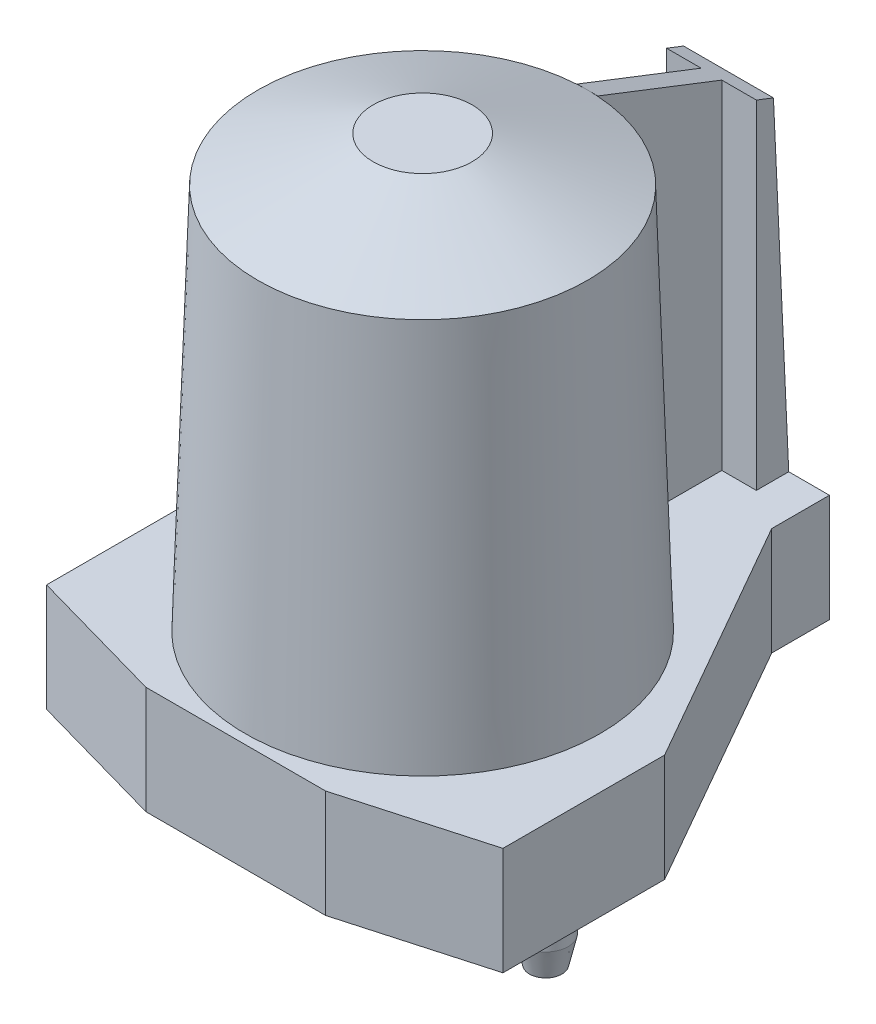
ISO-10303-21;
HEADER;
FILE_DESCRIPTION(('STEP AP214'),'2;1');
FILE_NAME('part.step','',(''),(''),'','','');
FILE_SCHEMA(('AUTOMOTIVE_DESIGN { 1 0 10303 214 1 1 1 1 }'));
ENDSEC;
DATA;
#1=APPLICATION_CONTEXT('core data for automotive mechanical design processes');
#2=APPLICATION_PROTOCOL_DEFINITION('international standard','automotive_design',2000,#1);
#3=PRODUCT_CONTEXT('',#1,'mechanical');
#4=PRODUCT('Part','Part','',(#3));
#5=PRODUCT_RELATED_PRODUCT_CATEGORY('part','',(#4));
#6=PRODUCT_DEFINITION_FORMATION('','',#4);
#7=PRODUCT_DEFINITION_CONTEXT('part definition',#1,'design');
#8=PRODUCT_DEFINITION('design','',#6,#7);
#9=PRODUCT_DEFINITION_SHAPE('','',#8);
#10=(LENGTH_UNIT() NAMED_UNIT(*) SI_UNIT(.MILLI.,.METRE.));
#11=(NAMED_UNIT(*) PLANE_ANGLE_UNIT() SI_UNIT($,.RADIAN.));
#12=(NAMED_UNIT(*) SI_UNIT($,.STERADIAN.) SOLID_ANGLE_UNIT());
#13=UNCERTAINTY_MEASURE_WITH_UNIT(LENGTH_MEASURE(1.E-05),#10,'distance_accuracy_value','');
#14=(GEOMETRIC_REPRESENTATION_CONTEXT(3) GLOBAL_UNCERTAINTY_ASSIGNED_CONTEXT((#13)) GLOBAL_UNIT_ASSIGNED_CONTEXT((#10,
#11,#12)) REPRESENTATION_CONTEXT('',''));
#15=CARTESIAN_POINT('',(0.,0.,0.));
#16=DIRECTION('',(0.,0.,1.));
#17=DIRECTION('',(1.,0.,0.));
#18=AXIS2_PLACEMENT_3D('',#15,#16,#17);
#19=CARTESIAN_POINT('',(0.,6.,0.));
#20=DIRECTION('',(0.,-1.,0.));
#21=DIRECTION('',(0.,0.,-1.));
#22=AXIS2_PLACEMENT_3D('',#19,#20,#21);
#23=PLANE('',#22);
#24=DIRECTION('',(-1.,0.,0.));
#25=VECTOR('',#24,1.);
#26=CARTESIAN_POINT('',(2.5,6.,-16.0744409311704));
#27=LINE('',#26,#25);
#28=CARTESIAN_POINT('',(2.5,6.,-16.0744409311704));
#29=VERTEX_POINT('',#28);
#30=CARTESIAN_POINT('',(0.575,5.99999999999999,-16.0744409311704));
#31=VERTEX_POINT('',#30);
#32=EDGE_CURVE('E206',#29,#31,#27,.T.);
#33=ORIENTED_EDGE('',*,*,#32,.T.);
#34=DIRECTION('',(0.,0.,-1.));
#35=VECTOR('',#34,1.);
#36=CARTESIAN_POINT('',(0.575,6.,-9.875));
#37=LINE('',#36,#35);
#38=CARTESIAN_POINT('',(0.575,6.,-9.85824527996742));
#39=VERTEX_POINT('',#38);
#40=EDGE_CURVE('E226',#39,#31,#37,.T.);
#41=ORIENTED_EDGE('',*,*,#40,.F.);
#42=CARTESIAN_POINT('',(0.,6.,0.));
#43=DIRECTION('',(0.,1.,0.));
#44=DIRECTION('',(0.,0.,1.));
#45=AXIS2_PLACEMENT_3D('',#42,#43,#44);
#46=CIRCLE('',#45,9.875);
#47=CARTESIAN_POINT('',(-0.575,6.,-9.85824527996742));
#48=VERTEX_POINT('',#47);
#49=EDGE_CURVE('E331',#48,#39,#46,.T.);
#50=ORIENTED_EDGE('',*,*,#49,.F.);
#51=DIRECTION('',(0.,0.,-1.));
#52=VECTOR('',#51,1.);
#53=CARTESIAN_POINT('',(-0.575,6.,-17.875));
#54=LINE('',#53,#52);
#55=CARTESIAN_POINT('',(-0.575,6.,-16.0744409311704));
#56=VERTEX_POINT('',#55);
#57=EDGE_CURVE('E235',#48,#56,#54,.T.);
#58=ORIENTED_EDGE('',*,*,#57,.T.);
#59=CARTESIAN_POINT('',(-2.5,6.,-16.0744409311704));
#60=VERTEX_POINT('',#59);
#61=EDGE_CURVE('E54',#56,#60,#27,.T.);
#62=ORIENTED_EDGE('',*,*,#61,.T.);
#63=DIRECTION('',(0.,0.,-1.));
#64=VECTOR('',#63,1.);
#65=CARTESIAN_POINT('',(-2.5,6.,-17.875));
#66=LINE('',#65,#64);
#67=CARTESIAN_POINT('',(-2.5,6.,-17.875));
#68=VERTEX_POINT('',#67);
#69=EDGE_CURVE('E199',#60,#68,#66,.T.);
#70=ORIENTED_EDGE('',*,*,#69,.T.);
#71=DIRECTION('',(-1.,0.,0.));
#72=VECTOR('',#71,1.);
#73=CARTESIAN_POINT('',(10.7712987771172,6.,-17.875));
#74=LINE('',#73,#72);
#75=CARTESIAN_POINT('',(-4.765,6.,-17.875));
#76=VERTEX_POINT('',#75);
#77=EDGE_CURVE('E213',#68,#76,#74,.T.);
#78=ORIENTED_EDGE('',*,*,#77,.T.);
#79=DIRECTION('',(0.,0.,1.));
#80=VECTOR('',#79,1.);
#81=CARTESIAN_POINT('',(-4.765,6.,-14.6639849416337));
#82=LINE('',#81,#80);
#83=CARTESIAN_POINT('',(-4.765,6.,-14.6639849416337));
#84=VERTEX_POINT('',#83);
#85=EDGE_CURVE('E459',#76,#84,#82,.T.);
#86=ORIENTED_EDGE('',*,*,#85,.T.);
#87=DIRECTION('',(-0.4959375,0.,0.868358218763288));
#88=VECTOR('',#87,1.);
#89=CARTESIAN_POINT('',(-12.7,6.,-0.770253441421074));
#90=LINE('',#89,#88);
#91=CARTESIAN_POINT('',(-12.7,6.,-0.770253441421074));
#92=VERTEX_POINT('',#91);
#93=EDGE_CURVE('E460',#84,#92,#90,.T.);
#94=ORIENTED_EDGE('',*,*,#93,.T.);
#95=DIRECTION('',(0.,0.,1.));
#96=VECTOR('',#95,1.);
#97=CARTESIAN_POINT('',(-12.7,6.,8.22974655857893));
#98=LINE('',#97,#96);
#99=CARTESIAN_POINT('',(-12.7,6.,8.22974655857893));
#100=VERTEX_POINT('',#99);
#101=EDGE_CURVE('E409',#92,#100,#98,.T.);
#102=ORIENTED_EDGE('',*,*,#101,.T.);
#103=DIRECTION('',(0.9625,0.,0.271281680177634));
#104=VECTOR('',#103,1.);
#105=CARTESIAN_POINT('',(-5.,6.,10.4));
#106=LINE('',#105,#104);
#107=CARTESIAN_POINT('',(-5.,6.,10.4));
#108=VERTEX_POINT('',#107);
#109=EDGE_CURVE('E424',#100,#108,#106,.T.);
#110=ORIENTED_EDGE('',*,*,#109,.T.);
#111=DIRECTION('',(1.,0.,0.));
#112=VECTOR('',#111,1.);
#113=CARTESIAN_POINT('',(5.,6.,10.4));
#114=LINE('',#113,#112);
#115=CARTESIAN_POINT('',(5.,6.,10.4));
#116=VERTEX_POINT('',#115);
#117=EDGE_CURVE('E449',#108,#116,#114,.T.);
#118=ORIENTED_EDGE('',*,*,#117,.T.);
#119=DIRECTION('',(0.9625,0.,-0.271281680177633));
#120=VECTOR('',#119,1.);
#121=CARTESIAN_POINT('',(5.,6.,10.4));
#122=LINE('',#121,#120);
#123=CARTESIAN_POINT('',(12.7,6.,8.22974655857892));
#124=VERTEX_POINT('',#123);
#125=EDGE_CURVE('E451',#116,#124,#122,.T.);
#126=ORIENTED_EDGE('',*,*,#125,.T.);
#127=DIRECTION('',(0.,0.,-1.));
#128=VECTOR('',#127,1.);
#129=CARTESIAN_POINT('',(12.7,6.,8.22974655857892));
#130=LINE('',#129,#128);
#131=CARTESIAN_POINT('',(12.7,6.,-0.770253441421077));
#132=VERTEX_POINT('',#131);
#133=EDGE_CURVE('E453',#124,#132,#130,.T.);
#134=ORIENTED_EDGE('',*,*,#133,.T.);
#135=DIRECTION('',(-0.4959375,0.,-0.868358218763288));
#136=VECTOR('',#135,1.);
#137=CARTESIAN_POINT('',(12.7,6.,-0.770253441421077));
#138=LINE('',#137,#136);
#139=CARTESIAN_POINT('',(4.765,6.,-14.6639849416337));
#140=VERTEX_POINT('',#139);
#141=EDGE_CURVE('E455',#132,#140,#138,.T.);
#142=ORIENTED_EDGE('',*,*,#141,.T.);
#143=DIRECTION('',(0.,0.,-1.));
#144=VECTOR('',#143,1.);
#145=CARTESIAN_POINT('',(4.765,6.,-14.6639849416337));
#146=LINE('',#145,#144);
#147=CARTESIAN_POINT('',(4.765,6.,-17.875));
#148=VERTEX_POINT('',#147);
#149=EDGE_CURVE('E457',#140,#148,#146,.T.);
#150=ORIENTED_EDGE('',*,*,#149,.T.);
#151=CARTESIAN_POINT('',(2.5,6.,-17.875));
#152=VERTEX_POINT('',#151);
#153=EDGE_CURVE('E219',#148,#152,#74,.T.);
#154=ORIENTED_EDGE('',*,*,#153,.T.);
#155=DIRECTION('',(0.,0.,-1.));
#156=VECTOR('',#155,1.);
#157=CARTESIAN_POINT('',(2.5,6.,-17.875));
#158=LINE('',#157,#156);
#159=EDGE_CURVE('E47',#29,#152,#158,.T.);
#160=ORIENTED_EDGE('',*,*,#159,.F.);
#161=EDGE_LOOP('',(#33,#41,#50,#58,#62,#70,#78,#86,#94,#102,#110,#118,#126,#134,#142,#150,#154,#160));
#162=FACE_BOUND('',#161,.T.);
#163=ADVANCED_FACE('F32',(#162),#23,.F.);
#164=CARTESIAN_POINT('',(0.575,0.,0.));
#165=DIRECTION('',(1.,0.,0.));
#166=DIRECTION('',(0.,0.,-1.));
#167=AXIS2_PLACEMENT_3D('',#164,#165,#166);
#168=PLANE('',#167);
#169=ORIENTED_EDGE('',*,*,#40,.T.);
#170=DIRECTION('',(0.,1.,0.));
#171=VECTOR('',#170,1.);
#172=CARTESIAN_POINT('',(0.575,0.,-16.0744409311704));
#173=LINE('',#172,#171);
#174=CARTESIAN_POINT('',(0.575,24.8153926337858,-16.0744409311704));
#175=VERTEX_POINT('',#174);
#176=EDGE_CURVE('E208',#31,#175,#173,.T.);
#177=ORIENTED_EDGE('',*,*,#176,.T.);
#178=DIRECTION('',(0.,0.362621246252393,0.931936602868651));
#179=VECTOR('',#178,1.);
#180=CARTESIAN_POINT('',(0.575,27.5,-9.175));
#181=LINE('',#180,#179);
#182=CARTESIAN_POINT('',(0.575,27.5,-9.175));
#183=VERTEX_POINT('',#182);
#184=EDGE_CURVE('E230',#175,#183,#181,.T.);
#185=ORIENTED_EDGE('',*,*,#184,.T.);
#186=DIRECTION('',(0.,0.,1.));
#187=VECTOR('',#186,1.);
#188=CARTESIAN_POINT('',(0.575,27.5,-8.375));
#189=LINE('',#188,#187);
#190=CARTESIAN_POINT('',(0.575,27.5,-9.15696456256111));
#191=VERTEX_POINT('',#190);
#192=EDGE_CURVE('E223',#183,#191,#189,.T.);
#193=ORIENTED_EDGE('',*,*,#192,.T.);
#194=CARTESIAN_POINT('',(0.575,-10.2381493438928,-10.3877819749739));
#195=CARTESIAN_POINT('',(0.575,-3.92258606455253,-10.1818433551127));
#196=CARTESIAN_POINT('',(0.575,2.39297665254325,-9.97588748900272));
#197=CARTESIAN_POINT('',(0.575,15.0241006157113,-9.56393065339247));
#198=CARTESIAN_POINT('',(0.575,21.3396618617835,-9.35792968389225));
#199=CARTESIAN_POINT('',(0.575,40.6352403416185,-8.72846132617669));
#200=CARTESIAN_POINT('',(0.575,53.6152546454189,-8.30490412574988));
#201=CARTESIAN_POINT('',(0.575,66.5952636062189,-7.88118319722219));
#202=B_SPLINE_CURVE_WITH_KNOTS('',3,(#194,#195,#196,#197,#198,#199,#200,#201),.UNSPECIFIED.,.F.,
.F.,(4,2,2,4),(0.,18.9567600676243,37.9135201352793,76.8742894829481),.UNSPECIFIED.);
#203=EDGE_CURVE('E248',#191,#39,#202,.F.);
#204=ORIENTED_EDGE('',*,*,#203,.T.);
#205=EDGE_LOOP('',(#169,#177,#185,#193,#204));
#206=FACE_BOUND('',#205,.T.);
#207=ADVANCED_FACE('F269',(#206),#168,.T.);
#208=CARTESIAN_POINT('',(-0.575,0.,0.));
#209=DIRECTION('',(1.,0.,0.));
#210=DIRECTION('',(0.,0.,-1.));
#211=AXIS2_PLACEMENT_3D('',#208,#209,#210);
#212=PLANE('',#211);
#213=DIRECTION('',(0.,1.,0.));
#214=VECTOR('',#213,1.);
#215=CARTESIAN_POINT('',(-0.575,0.,-16.0744409311704));
#216=LINE('',#215,#214);
#217=CARTESIAN_POINT('',(-0.575,24.8153926337858,-16.0744409311704));
#218=VERTEX_POINT('',#217);
#219=EDGE_CURVE('E327',#56,#218,#216,.T.);
#220=ORIENTED_EDGE('',*,*,#219,.F.);
#221=ORIENTED_EDGE('',*,*,#57,.F.);
#222=CARTESIAN_POINT('',(-0.575,-10.2381493438928,-10.3877819749739));
#223=CARTESIAN_POINT('',(-0.575,-3.92258606455253,-10.1818433551127));
#224=CARTESIAN_POINT('',(-0.575,2.39297665254325,-9.97588748900272));
#225=CARTESIAN_POINT('',(-0.575,15.0241006157113,-9.56393065339247));
#226=CARTESIAN_POINT('',(-0.575,21.3396618617835,-9.35792968389225));
#227=CARTESIAN_POINT('',(-0.575,40.6352403416185,-8.72846132617669));
#228=CARTESIAN_POINT('',(-0.575,53.6152546454189,-8.30490412574988));
#229=CARTESIAN_POINT('',(-0.575,66.5952636062189,-7.88118319722219));
#230=B_SPLINE_CURVE_WITH_KNOTS('',3,(#222,#223,#224,#225,#226,#227,#228,#229),.UNSPECIFIED.,.F.,
.F.,(4,2,2,4),(0.,18.9567600676243,37.9135201352793,76.8742894829481),.UNSPECIFIED.);
#231=CARTESIAN_POINT('',(-0.575,27.5,-9.15696456256111));
#232=VERTEX_POINT('',#231);
#233=EDGE_CURVE('E240',#232,#48,#230,.F.);
#234=ORIENTED_EDGE('',*,*,#233,.F.);
#235=DIRECTION('',(0.,0.,1.));
#236=VECTOR('',#235,1.);
#237=CARTESIAN_POINT('',(-0.575,27.5,-8.375));
#238=LINE('',#237,#236);
#239=CARTESIAN_POINT('',(-0.575,27.5,-9.175));
#240=VERTEX_POINT('',#239);
#241=EDGE_CURVE('E217',#240,#232,#238,.T.);
#242=ORIENTED_EDGE('',*,*,#241,.F.);
#243=DIRECTION('',(0.,0.362621246252393,0.931936602868651));
#244=VECTOR('',#243,1.);
#245=CARTESIAN_POINT('',(-0.575,27.5,-9.175));
#246=LINE('',#245,#244);
#247=EDGE_CURVE('E227',#218,#240,#246,.T.);
#248=ORIENTED_EDGE('',*,*,#247,.F.);
#249=EDGE_LOOP('',(#220,#221,#234,#242,#248));
#250=FACE_BOUND('',#249,.T.);
#251=ADVANCED_FACE('F254',(#250),#212,.F.);
#252=CARTESIAN_POINT('',(-5.,6.,10.4));
#253=DIRECTION('',(0.271281680177634,0.,-0.9625));
#254=DIRECTION('',(-0.9625,0.,-0.271281680177634));
#255=AXIS2_PLACEMENT_3D('',#252,#253,#254);
#256=PLANE('',#255);
#257=DIRECTION('',(0.9625,0.,0.271281680177634));
#258=VECTOR('',#257,1.);
#259=CARTESIAN_POINT('',(-5.,0.,10.4));
#260=LINE('',#259,#258);
#261=CARTESIAN_POINT('',(-12.7,0.,8.22974655857893));
#262=VERTEX_POINT('',#261);
#263=CARTESIAN_POINT('',(-5.,0.,10.4));
#264=VERTEX_POINT('',#263);
#265=EDGE_CURVE('E392',#262,#264,#260,.T.);
#266=ORIENTED_EDGE('',*,*,#265,.T.);
#267=DIRECTION('',(0.,-1.,0.));
#268=VECTOR('',#267,1.);
#269=CARTESIAN_POINT('',(-5.,6.,10.4));
#270=LINE('',#269,#268);
#271=EDGE_CURVE('E444',#108,#264,#270,.T.);
#272=ORIENTED_EDGE('',*,*,#271,.F.);
#273=ORIENTED_EDGE('',*,*,#109,.F.);
#274=DIRECTION('',(0.,-1.,0.));
#275=VECTOR('',#274,1.);
#276=CARTESIAN_POINT('',(-12.7,6.,8.22974655857893));
#277=LINE('',#276,#275);
#278=EDGE_CURVE('E425',#100,#262,#277,.T.);
#279=ORIENTED_EDGE('',*,*,#278,.T.);
#280=EDGE_LOOP('',(#266,#272,#273,#279));
#281=FACE_BOUND('',#280,.T.);
#282=ADVANCED_FACE('F304',(#281),#256,.F.);
#283=CARTESIAN_POINT('',(5.,6.,10.4));
#284=DIRECTION('',(0.,0.,-1.));
#285=DIRECTION('',(-1.,0.,0.));
#286=AXIS2_PLACEMENT_3D('',#283,#284,#285);
#287=PLANE('',#286);
#288=DIRECTION('',(1.,0.,0.));
#289=VECTOR('',#288,1.);
#290=CARTESIAN_POINT('',(5.,0.,10.4));
#291=LINE('',#290,#289);
#292=CARTESIAN_POINT('',(5.,0.,10.4));
#293=VERTEX_POINT('',#292);
#294=EDGE_CURVE('E396',#264,#293,#291,.T.);
#295=ORIENTED_EDGE('',*,*,#294,.T.);
#296=DIRECTION('',(0.,-1.,0.));
#297=VECTOR('',#296,1.);
#298=CARTESIAN_POINT('',(5.,6.,10.4));
#299=LINE('',#298,#297);
#300=EDGE_CURVE('E442',#116,#293,#299,.T.);
#301=ORIENTED_EDGE('',*,*,#300,.F.);
#302=ORIENTED_EDGE('',*,*,#117,.F.);
#303=ORIENTED_EDGE('',*,*,#271,.T.);
#304=EDGE_LOOP('',(#295,#301,#302,#303));
#305=FACE_BOUND('',#304,.T.);
#306=ADVANCED_FACE('F300',(#305),#287,.F.);
#307=CARTESIAN_POINT('',(5.,6.,10.4));
#308=DIRECTION('',(-0.271281680177633,0.,-0.9625));
#309=DIRECTION('',(-0.9625,0.,0.271281680177633));
#310=AXIS2_PLACEMENT_3D('',#307,#308,#309);
#311=PLANE('',#310);
#312=DIRECTION('',(0.9625,0.,-0.271281680177633));
#313=VECTOR('',#312,1.);
#314=CARTESIAN_POINT('',(5.,0.,10.4));
#315=LINE('',#314,#313);
#316=CARTESIAN_POINT('',(12.7,0.,8.22974655857892));
#317=VERTEX_POINT('',#316);
#318=EDGE_CURVE('E402',#293,#317,#315,.T.);
#319=ORIENTED_EDGE('',*,*,#318,.T.);
#320=DIRECTION('',(0.,-1.,0.));
#321=VECTOR('',#320,1.);
#322=CARTESIAN_POINT('',(12.7,6.,8.22974655857892));
#323=LINE('',#322,#321);
#324=EDGE_CURVE('E439',#124,#317,#323,.T.);
#325=ORIENTED_EDGE('',*,*,#324,.F.);
#326=ORIENTED_EDGE('',*,*,#125,.F.);
#327=ORIENTED_EDGE('',*,*,#300,.T.);
#328=EDGE_LOOP('',(#319,#325,#326,#327));
#329=FACE_BOUND('',#328,.T.);
#330=ADVANCED_FACE('F296',(#329),#311,.F.);
#331=CARTESIAN_POINT('',(12.7,6.,8.22974655857892));
#332=DIRECTION('',(-1.,0.,0.));
#333=DIRECTION('',(0.,0.,1.));
#334=AXIS2_PLACEMENT_3D('',#331,#332,#333);
#335=PLANE('',#334);
#336=DIRECTION('',(0.,0.,-1.));
#337=VECTOR('',#336,1.);
#338=CARTESIAN_POINT('',(12.7,0.,8.22974655857892));
#339=LINE('',#338,#337);
#340=CARTESIAN_POINT('',(12.7,0.,-0.770253441421077));
#341=VERTEX_POINT('',#340);
#342=EDGE_CURVE('E413',#317,#341,#339,.T.);
#343=ORIENTED_EDGE('',*,*,#342,.T.);
#344=DIRECTION('',(0.,-1.,0.));
#345=VECTOR('',#344,1.);
#346=CARTESIAN_POINT('',(12.7,6.,-0.770253441421077));
#347=LINE('',#346,#345);
#348=EDGE_CURVE('E436',#132,#341,#347,.T.);
#349=ORIENTED_EDGE('',*,*,#348,.F.);
#350=ORIENTED_EDGE('',*,*,#133,.F.);
#351=ORIENTED_EDGE('',*,*,#324,.T.);
#352=EDGE_LOOP('',(#343,#349,#350,#351));
#353=FACE_BOUND('',#352,.T.);
#354=ADVANCED_FACE('F292',(#353),#335,.F.);
#355=CARTESIAN_POINT('',(12.7,6.,-0.770253441421077));
#356=DIRECTION('',(-0.868358218763288,0.,0.4959375));
#357=DIRECTION('',(0.4959375,0.,0.868358218763288));
#358=AXIS2_PLACEMENT_3D('',#355,#356,#357);
#359=PLANE('',#358);
#360=DIRECTION('',(-0.4959375,0.,-0.868358218763288));
#361=VECTOR('',#360,1.);
#362=CARTESIAN_POINT('',(12.7,0.,-0.770253441421077));
#363=LINE('',#362,#361);
#364=CARTESIAN_POINT('',(4.765,0.,-14.6639849416337));
#365=VERTEX_POINT('',#364);
#366=EDGE_CURVE('E415',#341,#365,#363,.T.);
#367=ORIENTED_EDGE('',*,*,#366,.T.);
#368=DIRECTION('',(0.,-1.,0.));
#369=VECTOR('',#368,1.);
#370=CARTESIAN_POINT('',(4.765,6.,-14.6639849416337));
#371=LINE('',#370,#369);
#372=EDGE_CURVE('E433',#140,#365,#371,.T.);
#373=ORIENTED_EDGE('',*,*,#372,.F.);
#374=ORIENTED_EDGE('',*,*,#141,.F.);
#375=ORIENTED_EDGE('',*,*,#348,.T.);
#376=EDGE_LOOP('',(#367,#373,#374,#375));
#377=FACE_BOUND('',#376,.T.);
#378=ADVANCED_FACE('F288',(#377),#359,.F.);
#379=CARTESIAN_POINT('',(4.765,6.,-14.6639849416337));
#380=DIRECTION('',(-1.,0.,0.));
#381=DIRECTION('',(0.,0.,1.));
#382=AXIS2_PLACEMENT_3D('',#379,#380,#381);
#383=PLANE('',#382);
#384=DIRECTION('',(0.,0.,-1.));
#385=VECTOR('',#384,1.);
#386=CARTESIAN_POINT('',(4.765,0.,-14.6639849416337));
#387=LINE('',#386,#385);
#388=CARTESIAN_POINT('',(4.765,0.,-17.875));
#389=VERTEX_POINT('',#388);
#390=EDGE_CURVE('E417',#365,#389,#387,.T.);
#391=ORIENTED_EDGE('',*,*,#390,.T.);
#392=DIRECTION('',(0.,-1.,0.));
#393=VECTOR('',#392,1.);
#394=CARTESIAN_POINT('',(4.765,6.,-17.875));
#395=LINE('',#394,#393);
#396=EDGE_CURVE('E214',#148,#389,#395,.T.);
#397=ORIENTED_EDGE('',*,*,#396,.F.);
#398=ORIENTED_EDGE('',*,*,#149,.F.);
#399=ORIENTED_EDGE('',*,*,#372,.T.);
#400=EDGE_LOOP('',(#391,#397,#398,#399));
#401=FACE_BOUND('',#400,.T.);
#402=ADVANCED_FACE('F284',(#401),#383,.F.);
#403=CARTESIAN_POINT('',(-4.765,6.,-14.6639849416337));
#404=DIRECTION('',(1.,0.,0.));
#405=DIRECTION('',(0.,0.,-1.));
#406=AXIS2_PLACEMENT_3D('',#403,#404,#405);
#407=PLANE('',#406);
#408=DIRECTION('',(0.,0.,1.));
#409=VECTOR('',#408,1.);
#410=CARTESIAN_POINT('',(-4.765,0.,-14.6639849416337));
#411=LINE('',#410,#409);
#412=CARTESIAN_POINT('',(-4.765,0.,-17.875));
#413=VERTEX_POINT('',#412);
#414=CARTESIAN_POINT('',(-4.765,0.,-14.6639849416337));
#415=VERTEX_POINT('',#414);
#416=EDGE_CURVE('E419',#413,#415,#411,.T.);
#417=ORIENTED_EDGE('',*,*,#416,.T.);
#418=DIRECTION('',(0.,-1.,0.));
#419=VECTOR('',#418,1.);
#420=CARTESIAN_POINT('',(-4.765,6.,-14.6639849416337));
#421=LINE('',#420,#419);
#422=EDGE_CURVE('E430',#84,#415,#421,.T.);
#423=ORIENTED_EDGE('',*,*,#422,.F.);
#424=ORIENTED_EDGE('',*,*,#85,.F.);
#425=DIRECTION('',(0.,-1.,0.));
#426=VECTOR('',#425,1.);
#427=CARTESIAN_POINT('',(-4.765,6.,-17.875));
#428=LINE('',#427,#426);
#429=EDGE_CURVE('E210',#76,#413,#428,.T.);
#430=ORIENTED_EDGE('',*,*,#429,.T.);
#431=EDGE_LOOP('',(#417,#423,#424,#430));
#432=FACE_BOUND('',#431,.T.);
#433=ADVANCED_FACE('F280',(#432),#407,.F.);
#434=CARTESIAN_POINT('',(-12.7,6.,-0.770253441421074));
#435=DIRECTION('',(0.868358218763288,0.,0.4959375));
#436=DIRECTION('',(0.4959375,0.,-0.868358218763288));
#437=AXIS2_PLACEMENT_3D('',#434,#435,#436);
#438=PLANE('',#437);
#439=DIRECTION('',(-0.4959375,0.,0.868358218763288));
#440=VECTOR('',#439,1.);
#441=CARTESIAN_POINT('',(-12.7,0.,-0.770253441421074));
#442=LINE('',#441,#440);
#443=CARTESIAN_POINT('',(-12.7,0.,-0.770253441421074));
#444=VERTEX_POINT('',#443);
#445=EDGE_CURVE('E421',#415,#444,#442,.T.);
#446=ORIENTED_EDGE('',*,*,#445,.T.);
#447=DIRECTION('',(0.,-1.,0.));
#448=VECTOR('',#447,1.);
#449=CARTESIAN_POINT('',(-12.7,6.,-0.770253441421074));
#450=LINE('',#449,#448);
#451=EDGE_CURVE('E427',#92,#444,#450,.T.);
#452=ORIENTED_EDGE('',*,*,#451,.F.);
#453=ORIENTED_EDGE('',*,*,#93,.F.);
#454=ORIENTED_EDGE('',*,*,#422,.T.);
#455=EDGE_LOOP('',(#446,#452,#453,#454));
#456=FACE_BOUND('',#455,.T.);
#457=ADVANCED_FACE('F276',(#456),#438,.F.);
#458=CARTESIAN_POINT('',(-12.7,6.,8.22974655857893));
#459=DIRECTION('',(1.,0.,0.));
#460=DIRECTION('',(0.,0.,-1.));
#461=AXIS2_PLACEMENT_3D('',#458,#459,#460);
#462=PLANE('',#461);
#463=DIRECTION('',(0.,0.,1.));
#464=VECTOR('',#463,1.);
#465=CARTESIAN_POINT('',(-12.7,0.,8.22974655857893));
#466=LINE('',#465,#464);
#467=EDGE_CURVE('E394',#444,#262,#466,.T.);
#468=ORIENTED_EDGE('',*,*,#467,.T.);
#469=ORIENTED_EDGE('',*,*,#278,.F.);
#470=ORIENTED_EDGE('',*,*,#101,.F.);
#471=ORIENTED_EDGE('',*,*,#451,.T.);
#472=EDGE_LOOP('',(#468,#469,#470,#471));
#473=FACE_BOUND('',#472,.T.);
#474=ADVANCED_FACE('F272',(#473),#462,.F.);
#475=CARTESIAN_POINT('',(0.,0.,0.));
#476=DIRECTION('',(0.,-1.,0.));
#477=DIRECTION('',(0.,0.,-1.));
#478=AXIS2_PLACEMENT_3D('',#475,#476,#477);
#479=PLANE('',#478);
#480=CARTESIAN_POINT('',(11.,0.,4.15));
#481=DIRECTION('',(0.,-1.,0.));
#482=DIRECTION('',(0.,0.,1.));
#483=AXIS2_PLACEMENT_3D('',#480,#481,#482);
#484=CIRCLE('',#483,1.25);
#485=CARTESIAN_POINT('',(11.,0.,5.4));
#486=VERTEX_POINT('',#485);
#487=EDGE_CURVE('E382',#486,#486,#484,.T.);
#488=ORIENTED_EDGE('',*,*,#487,.F.);
#489=EDGE_LOOP('',(#488));
#490=FACE_BOUND('',#489,.T.);
#491=CARTESIAN_POINT('',(-11.,0.,4.15));
#492=DIRECTION('',(0.,-1.,0.));
#493=DIRECTION('',(0.,0.,-1.));
#494=AXIS2_PLACEMENT_3D('',#491,#492,#493);
#495=CIRCLE('',#494,1.25);
#496=CARTESIAN_POINT('',(-11.,0.,2.9));
#497=VERTEX_POINT('',#496);
#498=EDGE_CURVE('E200',#497,#497,#495,.T.);
#499=ORIENTED_EDGE('',*,*,#498,.F.);
#500=EDGE_LOOP('',(#499));
#501=FACE_BOUND('',#500,.T.);
#502=ORIENTED_EDGE('',*,*,#265,.F.);
#503=ORIENTED_EDGE('',*,*,#467,.F.);
#504=ORIENTED_EDGE('',*,*,#445,.F.);
#505=ORIENTED_EDGE('',*,*,#416,.F.);
#506=DIRECTION('',(-1.,0.,0.));
#507=VECTOR('',#506,1.);
#508=CARTESIAN_POINT('',(10.7712987771172,0.,-17.875));
#509=LINE('',#508,#507);
#510=EDGE_CURVE('E218',#389,#413,#509,.T.);
#511=ORIENTED_EDGE('',*,*,#510,.F.);
#512=ORIENTED_EDGE('',*,*,#390,.F.);
#513=ORIENTED_EDGE('',*,*,#366,.F.);
#514=ORIENTED_EDGE('',*,*,#342,.F.);
#515=ORIENTED_EDGE('',*,*,#318,.F.);
#516=ORIENTED_EDGE('',*,*,#294,.F.);
#517=EDGE_LOOP('',(#502,#503,#504,#505,#511,#512,#513,#514,#515,#516));
#518=FACE_BOUND('',#517,.T.);
#519=ADVANCED_FACE('F263',(#490,#501,#518),#479,.T.);
#520=CARTESIAN_POINT('',(0.,27.5,0.));
#521=DIRECTION('',(0.,-1.,0.));
#522=DIRECTION('',(0.,0.,-1.));
#523=AXIS2_PLACEMENT_3D('',#520,#521,#522);
#524=CONICAL_SURFACE('',#523,9.175,0.0325466426181221);
#525=ORIENTED_EDGE('',*,*,#203,.F.);
#526=CARTESIAN_POINT('',(0.,27.5,0.));
#527=DIRECTION('',(0.,1.,0.));
#528=DIRECTION('',(0.,0.,1.));
#529=AXIS2_PLACEMENT_3D('',#526,#527,#528);
#530=CIRCLE('',#529,9.175);
#531=EDGE_CURVE('E407',#232,#191,#530,.T.);
#532=ORIENTED_EDGE('',*,*,#531,.F.);
#533=ORIENTED_EDGE('',*,*,#233,.T.);
#534=ORIENTED_EDGE('',*,*,#49,.T.);
#535=EDGE_LOOP('',(#525,#532,#533,#534));
#536=FACE_BOUND('',#535,.T.);
#537=ADVANCED_FACE('F257',(#536),#524,.T.);
#538=CARTESIAN_POINT('',(0.,30.,0.));
#539=DIRECTION('',(0.,-1.,0.));
#540=DIRECTION('',(0.,0.,-1.));
#541=AXIS2_PLACEMENT_3D('',#538,#539,#540);
#542=CONICAL_SURFACE('',#541,2.75,1.19971727981696);
#543=CARTESIAN_POINT('',(0.,27.5,-9.175));
#544=VERTEX_POINT('',#543);
#545=EDGE_CURVE('E400',#191,#544,#530,.T.);
#546=ORIENTED_EDGE('',*,*,#545,.T.);
#547=EDGE_CURVE('E405',#544,#232,#530,.T.);
#548=ORIENTED_EDGE('',*,*,#547,.T.);
#549=ORIENTED_EDGE('',*,*,#531,.T.);
#550=EDGE_LOOP('',(#546,#548,#549));
#551=FACE_BOUND('',#550,.T.);
#552=CARTESIAN_POINT('',(0.,30.,0.));
#553=DIRECTION('',(0.,1.,0.));
#554=DIRECTION('',(0.,0.,1.));
#555=AXIS2_PLACEMENT_3D('',#552,#553,#554);
#556=CIRCLE('',#555,2.75);
#557=CARTESIAN_POINT('',(0.,30.,2.75));
#558=VERTEX_POINT('',#557);
#559=EDGE_CURVE('E497',#558,#558,#556,.T.);
#560=ORIENTED_EDGE('',*,*,#559,.F.);
#561=EDGE_LOOP('',(#560));
#562=FACE_BOUND('',#561,.T.);
#563=ADVANCED_FACE('F262',(#551,#562),#542,.T.);
#564=CARTESIAN_POINT('',(0.,30.,2.75));
#565=DIRECTION('',(0.,1.,0.));
#566=DIRECTION('',(0.,0.,1.));
#567=AXIS2_PLACEMENT_3D('',#564,#565,#566);
#568=PLANE('',#567);
#569=ORIENTED_EDGE('',*,*,#559,.T.);
#570=EDGE_LOOP('',(#569));
#571=FACE_BOUND('',#570,.T.);
#572=ADVANCED_FACE('F510',(#571),#568,.T.);
#573=CARTESIAN_POINT('',(0.575,27.5,-8.375));
#574=DIRECTION('',(0.,-1.,0.));
#575=DIRECTION('',(0.,0.,-1.));
#576=AXIS2_PLACEMENT_3D('',#573,#574,#575);
#577=PLANE('',#576);
#578=ORIENTED_EDGE('',*,*,#547,.F.);
#579=DIRECTION('',(-1.,0.,0.));
#580=VECTOR('',#579,1.);
#581=CARTESIAN_POINT('',(0.575,27.5,-9.175));
#582=LINE('',#581,#580);
#583=EDGE_CURVE('E232',#544,#240,#582,.T.);
#584=ORIENTED_EDGE('',*,*,#583,.T.);
#585=ORIENTED_EDGE('',*,*,#241,.T.);
#586=EDGE_LOOP('',(#578,#584,#585));
#587=FACE_BOUND('',#586,.T.);
#588=ADVANCED_FACE('F493',(#587),#577,.F.);
#589=ORIENTED_EDGE('',*,*,#545,.F.);
#590=ORIENTED_EDGE('',*,*,#192,.F.);
#591=EDGE_CURVE('E179',#183,#544,#582,.T.);
#592=ORIENTED_EDGE('',*,*,#591,.T.);
#593=EDGE_LOOP('',(#589,#590,#592));
#594=FACE_BOUND('',#593,.T.);
#595=ADVANCED_FACE('F501',(#594),#577,.F.);
#596=CARTESIAN_POINT('',(0.575,24.4457428283384,-17.0244409311704));
#597=DIRECTION('',(0.,-0.0460624579194394,0.998938561659535));
#598=DIRECTION('',(0.,-0.998938561659535,-0.0460624579194394));
#599=AXIS2_PLACEMENT_3D('',#596,#597,#598);
#600=PLANE('',#599);
#601=DIRECTION('',(-1.,0.,0.));
#602=VECTOR('',#601,1.);
#603=CARTESIAN_POINT('',(0.575,6.,-17.875));
#604=LINE('',#603,#602);
#605=EDGE_CURVE('E178',#152,#68,#604,.T.);
#606=ORIENTED_EDGE('',*,*,#605,.T.);
#607=DIRECTION('',(0.,0.998938561659535,0.0460624579194396));
#608=VECTOR('',#607,1.);
#609=CARTESIAN_POINT('',(-2.5,24.4457428283384,-17.0244409311704));
#610=LINE('',#609,#608);
#611=CARTESIAN_POINT('',(-2.5,24.4457428283384,-17.0244409311704));
#612=VERTEX_POINT('',#611);
#613=EDGE_CURVE('E173',#68,#612,#610,.T.);
#614=ORIENTED_EDGE('',*,*,#613,.T.);
#615=DIRECTION('',(-1.,0.,0.));
#616=VECTOR('',#615,1.);
#617=CARTESIAN_POINT('',(0.575,24.4457428283384,-17.0244409311704));
#618=LINE('',#617,#616);
#619=CARTESIAN_POINT('',(2.5,24.4457428283384,-17.0244409311704));
#620=VERTEX_POINT('',#619);
#621=EDGE_CURVE('E168',#620,#612,#618,.T.);
#622=ORIENTED_EDGE('',*,*,#621,.F.);
#623=DIRECTION('',(0.,0.998938561659535,0.0460624579194396));
#624=VECTOR('',#623,1.);
#625=CARTESIAN_POINT('',(2.5,24.4457428283384,-17.0244409311704));
#626=LINE('',#625,#624);
#627=EDGE_CURVE('E171',#152,#620,#626,.T.);
#628=ORIENTED_EDGE('',*,*,#627,.F.);
#629=EDGE_LOOP('',(#606,#614,#622,#628));
#630=FACE_BOUND('',#629,.T.);
#631=ADVANCED_FACE('F170',(#630),#600,.F.);
#632=CARTESIAN_POINT('',(0.575,27.5,-9.175));
#633=DIRECTION('',(0.,-0.931936602868651,0.362621246252393));
#634=DIRECTION('',(0.,-0.362621246252393,-0.931936602868651));
#635=AXIS2_PLACEMENT_3D('',#632,#633,#634);
#636=PLANE('',#635);
#637=ORIENTED_EDGE('',*,*,#621,.T.);
#638=DIRECTION('',(0.,0.362621246252392,0.931936602868651));
#639=VECTOR('',#638,1.);
#640=CARTESIAN_POINT('',(-2.5,24.8153926337858,-16.0744409311704));
#641=LINE('',#640,#639);
#642=CARTESIAN_POINT('',(-2.5,24.8153926337858,-16.0744409311704));
#643=VERTEX_POINT('',#642);
#644=EDGE_CURVE('E203',#612,#643,#641,.T.);
#645=ORIENTED_EDGE('',*,*,#644,.T.);
#646=DIRECTION('',(-1.,0.,0.));
#647=VECTOR('',#646,1.);
#648=CARTESIAN_POINT('',(2.5,24.8153926337858,-16.0744409311704));
#649=LINE('',#648,#647);
#650=EDGE_CURVE('E191',#218,#643,#649,.T.);
#651=ORIENTED_EDGE('',*,*,#650,.F.);
#652=ORIENTED_EDGE('',*,*,#247,.T.);
#653=ORIENTED_EDGE('',*,*,#583,.F.);
#654=ORIENTED_EDGE('',*,*,#591,.F.);
#655=ORIENTED_EDGE('',*,*,#184,.F.);
#656=CARTESIAN_POINT('',(2.5,24.8153926337858,-16.0744409311704));
#657=VERTEX_POINT('',#656);
#658=EDGE_CURVE('E189',#657,#175,#649,.T.);
#659=ORIENTED_EDGE('',*,*,#658,.F.);
#660=DIRECTION('',(0.,0.362621246252392,0.931936602868651));
#661=VECTOR('',#660,1.);
#662=CARTESIAN_POINT('',(2.5,24.8153926337858,-16.0744409311704));
#663=LINE('',#662,#661);
#664=EDGE_CURVE('E183',#620,#657,#663,.T.);
#665=ORIENTED_EDGE('',*,*,#664,.F.);
#666=EDGE_LOOP('',(#637,#645,#651,#652,#653,#654,#655,#659,#665));
#667=FACE_BOUND('',#666,.T.);
#668=ADVANCED_FACE('F186',(#667),#636,.F.);
#669=CARTESIAN_POINT('',(10.7712987771172,6.,-17.875));
#670=DIRECTION('',(0.,0.,1.));
#671=DIRECTION('',(1.,0.,0.));
#672=AXIS2_PLACEMENT_3D('',#669,#670,#671);
#673=PLANE('',#672);
#674=ORIENTED_EDGE('',*,*,#153,.F.);
#675=ORIENTED_EDGE('',*,*,#396,.T.);
#676=ORIENTED_EDGE('',*,*,#510,.T.);
#677=ORIENTED_EDGE('',*,*,#429,.F.);
#678=ORIENTED_EDGE('',*,*,#77,.F.);
#679=ORIENTED_EDGE('',*,*,#605,.F.);
#680=EDGE_LOOP('',(#674,#675,#676,#677,#678,#679));
#681=FACE_BOUND('',#680,.T.);
#682=ADVANCED_FACE('F361',(#681),#673,.F.);
#683=CARTESIAN_POINT('',(2.5,6.,-16.0744409311704));
#684=DIRECTION('',(0.,0.,-1.));
#685=DIRECTION('',(0.,1.,0.));
#686=AXIS2_PLACEMENT_3D('',#683,#684,#685);
#687=PLANE('',#686);
#688=ORIENTED_EDGE('',*,*,#176,.F.);
#689=ORIENTED_EDGE('',*,*,#32,.F.);
#690=DIRECTION('',(0.,-1.,0.));
#691=VECTOR('',#690,1.);
#692=CARTESIAN_POINT('',(2.5,6.,-16.0744409311704));
#693=LINE('',#692,#691);
#694=EDGE_CURVE('E204',#657,#29,#693,.T.);
#695=ORIENTED_EDGE('',*,*,#694,.F.);
#696=ORIENTED_EDGE('',*,*,#658,.T.);
#697=EDGE_LOOP('',(#688,#689,#695,#696));
#698=FACE_BOUND('',#697,.T.);
#699=ADVANCED_FACE('F355',(#698),#687,.F.);
#700=CARTESIAN_POINT('',(2.5,0.,0.));
#701=DIRECTION('',(1.,0.,0.));
#702=DIRECTION('',(0.,0.,-1.));
#703=AXIS2_PLACEMENT_3D('',#700,#701,#702);
#704=PLANE('',#703);
#705=ORIENTED_EDGE('',*,*,#694,.T.);
#706=ORIENTED_EDGE('',*,*,#159,.T.);
#707=ORIENTED_EDGE('',*,*,#627,.T.);
#708=ORIENTED_EDGE('',*,*,#664,.T.);
#709=EDGE_LOOP('',(#705,#706,#707,#708));
#710=FACE_BOUND('',#709,.T.);
#711=ADVANCED_FACE('F182',(#710),#704,.T.);
#712=ORIENTED_EDGE('',*,*,#61,.F.);
#713=ORIENTED_EDGE('',*,*,#219,.T.);
#714=ORIENTED_EDGE('',*,*,#650,.T.);
#715=DIRECTION('',(0.,-1.,0.));
#716=VECTOR('',#715,1.);
#717=CARTESIAN_POINT('',(-2.5,6.,-16.0744409311704));
#718=LINE('',#717,#716);
#719=EDGE_CURVE('E196',#643,#60,#718,.T.);
#720=ORIENTED_EDGE('',*,*,#719,.T.);
#721=EDGE_LOOP('',(#712,#713,#714,#720));
#722=FACE_BOUND('',#721,.T.);
#723=ADVANCED_FACE('F354',(#722),#687,.F.);
#724=CARTESIAN_POINT('',(-2.5,0.,0.));
#725=DIRECTION('',(1.,0.,0.));
#726=DIRECTION('',(0.,0.,-1.));
#727=AXIS2_PLACEMENT_3D('',#724,#725,#726);
#728=PLANE('',#727);
#729=ORIENTED_EDGE('',*,*,#719,.F.);
#730=ORIENTED_EDGE('',*,*,#644,.F.);
#731=ORIENTED_EDGE('',*,*,#613,.F.);
#732=ORIENTED_EDGE('',*,*,#69,.F.);
#733=EDGE_LOOP('',(#729,#730,#731,#732));
#734=FACE_BOUND('',#733,.T.);
#735=ADVANCED_FACE('F348',(#734),#728,.F.);
#736=CARTESIAN_POINT('',(-11.,-2.5,4.15));
#737=DIRECTION('',(0.,1.,0.));
#738=DIRECTION('',(0.,0.,1.));
#739=AXIS2_PLACEMENT_3D('',#736,#737,#738);
#740=CYLINDRICAL_SURFACE('',#739,1.25);
#741=CARTESIAN_POINT('',(-11.,-0.999999999999957,4.15));
#742=DIRECTION('',(0.,-1.,0.));
#743=DIRECTION('',(0.,0.,-1.));
#744=AXIS2_PLACEMENT_3D('',#741,#742,#743);
#745=CIRCLE('',#744,1.25);
#746=CARTESIAN_POINT('',(-11.,-0.999999999999957,5.4));
#747=VERTEX_POINT('',#746);
#748=EDGE_CURVE('E11',#747,#747,#745,.F.);
#749=ORIENTED_EDGE('',*,*,#748,.T.);
#750=EDGE_LOOP('',(#749));
#751=FACE_BOUND('',#750,.T.);
#752=ORIENTED_EDGE('',*,*,#498,.T.);
#753=EDGE_LOOP('',(#752));
#754=FACE_BOUND('',#753,.T.);
#755=ADVANCED_FACE('F340',(#751,#754),#740,.T.);
#756=CARTESIAN_POINT('',(-11.,-2.5,4.15));
#757=DIRECTION('',(0.,-1.,0.));
#758=DIRECTION('',(0.,0.,-1.));
#759=AXIS2_PLACEMENT_3D('',#756,#757,#758);
#760=PLANE('',#759);
#761=CARTESIAN_POINT('',(-11.,-2.5,4.15));
#762=DIRECTION('',(0.,-1.,0.));
#763=DIRECTION('',(0.,0.,-1.));
#764=AXIS2_PLACEMENT_3D('',#761,#762,#763);
#765=CIRCLE('',#764,0.903697713311648);
#766=CARTESIAN_POINT('',(-11.,-2.5,5.05369771331165));
#767=VERTEX_POINT('',#766);
#768=EDGE_CURVE('E40',#767,#767,#765,.T.);
#769=ORIENTED_EDGE('',*,*,#768,.T.);
#770=EDGE_LOOP('',(#769));
#771=FACE_BOUND('',#770,.T.);
#772=ADVANCED_FACE('F337',(#771),#760,.T.);
#773=CARTESIAN_POINT('',(11.,-2.5,4.15));
#774=DIRECTION('',(0.,1.,0.));
#775=DIRECTION('',(0.,0.,1.));
#776=AXIS2_PLACEMENT_3D('',#773,#774,#775);
#777=CYLINDRICAL_SURFACE('',#776,1.25);
#778=CARTESIAN_POINT('',(11.,-0.999999999999957,4.15));
#779=DIRECTION('',(0.,1.,0.));
#780=DIRECTION('',(0.,0.,1.));
#781=AXIS2_PLACEMENT_3D('',#778,#779,#780);
#782=CIRCLE('',#781,1.25);
#783=CARTESIAN_POINT('',(11.,-0.999999999999957,5.4));
#784=VERTEX_POINT('',#783);
#785=EDGE_CURVE('E323',#784,#784,#782,.T.);
#786=ORIENTED_EDGE('',*,*,#785,.T.);
#787=EDGE_LOOP('',(#786));
#788=FACE_BOUND('',#787,.T.);
#789=ORIENTED_EDGE('',*,*,#487,.T.);
#790=EDGE_LOOP('',(#789));
#791=FACE_BOUND('',#790,.T.);
#792=ADVANCED_FACE('F317',(#788,#791),#777,.T.);
#793=CARTESIAN_POINT('',(11.,-2.5,4.15));
#794=DIRECTION('',(0.,1.,0.));
#795=DIRECTION('',(0.,0.,1.));
#796=AXIS2_PLACEMENT_3D('',#793,#794,#795);
#797=PLANE('',#796);
#798=CARTESIAN_POINT('',(11.,-2.5,4.15));
#799=DIRECTION('',(0.,1.,0.));
#800=DIRECTION('',(0.,0.,1.));
#801=AXIS2_PLACEMENT_3D('',#798,#799,#800);
#802=CIRCLE('',#801,0.903697713311648);
#803=CARTESIAN_POINT('',(11.,-2.5,5.05369771331165));
#804=VERTEX_POINT('',#803);
#805=EDGE_CURVE('E326',#804,#804,#802,.F.);
#806=ORIENTED_EDGE('',*,*,#805,.T.);
#807=EDGE_LOOP('',(#806));
#808=FACE_BOUND('',#807,.T.);
#809=ADVANCED_FACE('F310',(#808),#797,.F.);
#810=CARTESIAN_POINT('',(11.,-2.5,4.15));
#811=DIRECTION('',(0.,1.,0.));
#812=DIRECTION('',(0.,0.,1.));
#813=AXIS2_PLACEMENT_3D('',#810,#811,#812);
#814=CONICAL_SURFACE('',#813,0.903697713311648,0.226892802759261);
#815=CARTESIAN_POINT('',(11.,-0.999999999999957,5.4));
#816=CARTESIAN_POINT('',(11.,-1.01562499999996,5.39639268451366));
#817=CARTESIAN_POINT('',(11.,-1.03124999999996,5.39278536902732));
#818=CARTESIAN_POINT('',(11.,-1.06249999999996,5.38557073805465));
#819=CARTESIAN_POINT('',(11.,-1.07812499999996,5.38196342256831));
#820=CARTESIAN_POINT('',(11.,-1.10937499999996,5.37474879159564));
#821=CARTESIAN_POINT('',(11.,-1.12499999999996,5.3711414761093));
#822=CARTESIAN_POINT('',(11.,-1.15624999999996,5.36392684513663));
#823=CARTESIAN_POINT('',(11.,-1.17187499999996,5.36031952965029));
#824=CARTESIAN_POINT('',(11.,-1.20312499999996,5.35310489867762));
#825=CARTESIAN_POINT('',(11.,-1.21874999999996,5.34949758319128));
#826=CARTESIAN_POINT('',(11.,-1.24999999999996,5.34228295221861));
#827=CARTESIAN_POINT('',(11.,-1.26562499999996,5.33867563673227));
#828=CARTESIAN_POINT('',(11.,-1.29687499999997,5.3314610057596));
#829=CARTESIAN_POINT('',(11.,-1.31249999999997,5.32785369027326));
#830=CARTESIAN_POINT('',(11.,-1.34374999999997,5.32063905930058));
#831=CARTESIAN_POINT('',(11.,-1.35937499999997,5.31703174381425));
#832=CARTESIAN_POINT('',(11.,-1.39062499999997,5.30981711284157));
#833=CARTESIAN_POINT('',(11.,-1.40624999999997,5.30620979735524));
#834=CARTESIAN_POINT('',(11.,-1.43749999999997,5.29899516638256));
#835=CARTESIAN_POINT('',(11.,-1.45312499999997,5.29538785089623));
#836=CARTESIAN_POINT('',(11.,-1.48437499999997,5.28817321992355));
#837=CARTESIAN_POINT('',(11.,-1.49999999999997,5.28456590443721));
#838=CARTESIAN_POINT('',(11.,-1.53124999999997,5.27735127346454));
#839=CARTESIAN_POINT('',(11.,-1.54687499999997,5.2737439579782));
#840=CARTESIAN_POINT('',(11.,-1.57812499999997,5.26652932700553));
#841=CARTESIAN_POINT('',(11.,-1.59374999999997,5.26292201151919));
#842=CARTESIAN_POINT('',(11.,-1.62499999999997,5.25570738054652));
#843=CARTESIAN_POINT('',(11.,-1.64062499999998,5.25210006506018));
#844=CARTESIAN_POINT('',(11.,-1.67187499999998,5.24488543408751));
#845=CARTESIAN_POINT('',(11.,-1.68749999999998,5.24127811860117));
#846=CARTESIAN_POINT('',(11.,-1.71874999999998,5.2340634876285));
#847=CARTESIAN_POINT('',(11.,-1.73437499999998,5.23045617214216));
#848=CARTESIAN_POINT('',(11.,-1.76562499999998,5.22324154116949));
#849=CARTESIAN_POINT('',(11.,-1.78124999999998,5.21963422568315));
#850=CARTESIAN_POINT('',(11.,-1.81249999999998,5.21241959471047));
#851=CARTESIAN_POINT('',(11.,-1.82812499999998,5.20881227922414));
#852=CARTESIAN_POINT('',(11.,-1.85937499999998,5.20159764825146));
#853=CARTESIAN_POINT('',(11.,-1.87499999999998,5.19799033276513));
#854=CARTESIAN_POINT('',(11.,-1.90624999999998,5.19077570179245));
#855=CARTESIAN_POINT('',(11.,-1.92187499999998,5.18716838630612));
#856=CARTESIAN_POINT('',(11.,-1.95312499999998,5.17995375533344));
#857=CARTESIAN_POINT('',(11.,-1.96874999999998,5.1763464398471));
#858=CARTESIAN_POINT('',(11.,-1.99999999999999,5.16913180887443));
#859=CARTESIAN_POINT('',(11.,-2.01562499999999,5.16552449338809));
#860=CARTESIAN_POINT('',(11.,-2.04687499999999,5.15830986241542));
#861=CARTESIAN_POINT('',(11.,-2.06249999999999,5.15470254692908));
#862=CARTESIAN_POINT('',(11.,-2.09374999999999,5.14748791595641));
#863=CARTESIAN_POINT('',(11.,-2.10937499999999,5.14388060047007));
#864=CARTESIAN_POINT('',(11.,-2.14062499999999,5.1366659694974));
#865=CARTESIAN_POINT('',(11.,-2.15624999999999,5.13305865401106));
#866=CARTESIAN_POINT('',(11.,-2.18749999999999,5.12584402303839));
#867=CARTESIAN_POINT('',(11.,-2.20312499999999,5.12223670755205));
#868=CARTESIAN_POINT('',(11.,-2.23437499999999,5.11502207657938));
#869=CARTESIAN_POINT('',(11.,-2.24999999999999,5.11141476109304));
#870=CARTESIAN_POINT('',(11.,-2.28124999999999,5.10420013012036));
#871=CARTESIAN_POINT('',(11.,-2.29687499999999,5.10059281463403));
#872=CARTESIAN_POINT('',(11.,-2.328125,5.09337818366135));
#873=CARTESIAN_POINT('',(11.,-2.34375,5.08977086817502));
#874=CARTESIAN_POINT('',(11.,-2.375,5.08255623720234));
#875=CARTESIAN_POINT('',(11.,-2.390625,5.07894892171601));
#876=CARTESIAN_POINT('',(11.,-2.421875,5.07173429074333));
#877=CARTESIAN_POINT('',(11.,-2.4375,5.06812697525699));
#878=CARTESIAN_POINT('',(11.,-2.46875,5.06091234428432));
#879=CARTESIAN_POINT('',(11.,-2.484375,5.05730502879798));
#880=CARTESIAN_POINT('',(11.,-2.5,5.05369771331165));
#881=B_SPLINE_CURVE_WITH_KNOTS('',3,(#815,#816,#817,#818,#819,#820,#821,#822,#823,#824,#825,
#826,#827,#828,#829,#830,#831,#832,#833,#834,#835,#836,#837,#838,#839,#840,#841,#842,#843,#844,
#845,#846,#847,#848,#849,#850,#851,#852,#853,#854,#855,#856,#857,#858,#859,#860,#861,#862,#863,
#864,#865,#866,#867,#868,#869,#870,#871,#872,#873,#874,#875,#876,#877,#878,#879,#880),
.UNSPECIFIED.,.F.,.F.,(4,2,2,2,2,2,2,2,2,2,2,2,2,2,2,2,2,2,2,2,2,2,2,2,2,2,2,2,2,2,2,2,4),(0.,
0.0481080050528166,0.0962160101056331,0.14432401515845,0.192432020211266,0.240540025264083,
0.288648030316899,0.336756035369716,0.384864040422533,0.432972045475349,0.481080050528166,
0.529188055580982,0.577296060633799,0.625404065686616,0.673512070739432,0.721620075792249,
0.769728080845065,0.817836085897882,0.865944090950699,0.914052096003515,0.962160101056332,
1.01026810610915,1.05837611116196,1.10648411621478,1.1545921212676,1.20270012632041,
1.25080813137323,1.29891613642605,1.34702414147887,1.39513214653168,1.4432401515845,
1.49134815663732,1.53945616169013),.UNSPECIFIED.);
#882=EDGE_CURVE('BSEAM308',#784,#804,#881,.T.);
#883=ORIENTED_EDGE('',*,*,#785,.F.);
#884=ORIENTED_EDGE('',*,*,#805,.F.);
#885=ORIENTED_EDGE('',*,*,#882,.T.);
#886=ORIENTED_EDGE('',*,*,#882,.F.);
#887=EDGE_LOOP('',(#883,#885,#884,#886));
#888=FACE_BOUND('',#887,.T.);
#889=ADVANCED_FACE('F308',(#888),#814,.T.);
#890=CARTESIAN_POINT('',(-11.,-2.5,4.15));
#891=DIRECTION('',(0.,1.,0.));
#892=DIRECTION('',(0.,0.,1.));
#893=AXIS2_PLACEMENT_3D('',#890,#891,#892);
#894=CONICAL_SURFACE('',#893,0.903697713311648,0.226892802759261);
#895=CARTESIAN_POINT('',(-11.,-0.999999999999957,5.4));
#896=CARTESIAN_POINT('',(-11.,-1.01562499999996,5.39639268451366));
#897=CARTESIAN_POINT('',(-11.,-1.03124999999996,5.39278536902732));
#898=CARTESIAN_POINT('',(-11.,-1.06249999999996,5.38557073805465));
#899=CARTESIAN_POINT('',(-11.,-1.07812499999996,5.38196342256831));
#900=CARTESIAN_POINT('',(-11.,-1.10937499999996,5.37474879159564));
#901=CARTESIAN_POINT('',(-11.,-1.12499999999996,5.3711414761093));
#902=CARTESIAN_POINT('',(-11.,-1.15624999999996,5.36392684513663));
#903=CARTESIAN_POINT('',(-11.,-1.17187499999996,5.36031952965029));
#904=CARTESIAN_POINT('',(-11.,-1.20312499999996,5.35310489867762));
#905=CARTESIAN_POINT('',(-11.,-1.21874999999996,5.34949758319128));
#906=CARTESIAN_POINT('',(-11.,-1.24999999999996,5.34228295221861));
#907=CARTESIAN_POINT('',(-11.,-1.26562499999996,5.33867563673227));
#908=CARTESIAN_POINT('',(-11.,-1.29687499999997,5.3314610057596));
#909=CARTESIAN_POINT('',(-11.,-1.31249999999997,5.32785369027326));
#910=CARTESIAN_POINT('',(-11.,-1.34374999999997,5.32063905930058));
#911=CARTESIAN_POINT('',(-11.,-1.35937499999997,5.31703174381425));
#912=CARTESIAN_POINT('',(-11.,-1.39062499999997,5.30981711284157));
#913=CARTESIAN_POINT('',(-11.,-1.40624999999997,5.30620979735524));
#914=CARTESIAN_POINT('',(-11.,-1.43749999999997,5.29899516638256));
#915=CARTESIAN_POINT('',(-11.,-1.45312499999997,5.29538785089623));
#916=CARTESIAN_POINT('',(-11.,-1.48437499999997,5.28817321992355));
#917=CARTESIAN_POINT('',(-11.,-1.49999999999997,5.28456590443721));
#918=CARTESIAN_POINT('',(-11.,-1.53124999999997,5.27735127346454));
#919=CARTESIAN_POINT('',(-11.,-1.54687499999997,5.2737439579782));
#920=CARTESIAN_POINT('',(-11.,-1.57812499999997,5.26652932700553));
#921=CARTESIAN_POINT('',(-11.,-1.59374999999997,5.26292201151919));
#922=CARTESIAN_POINT('',(-11.,-1.62499999999997,5.25570738054652));
#923=CARTESIAN_POINT('',(-11.,-1.64062499999998,5.25210006506018));
#924=CARTESIAN_POINT('',(-11.,-1.67187499999998,5.24488543408751));
#925=CARTESIAN_POINT('',(-11.,-1.68749999999998,5.24127811860117));
#926=CARTESIAN_POINT('',(-11.,-1.71874999999998,5.2340634876285));
#927=CARTESIAN_POINT('',(-11.,-1.73437499999998,5.23045617214216));
#928=CARTESIAN_POINT('',(-11.,-1.76562499999998,5.22324154116949));
#929=CARTESIAN_POINT('',(-11.,-1.78124999999998,5.21963422568315));
#930=CARTESIAN_POINT('',(-11.,-1.81249999999998,5.21241959471048));
#931=CARTESIAN_POINT('',(-11.,-1.82812499999998,5.20881227922414));
#932=CARTESIAN_POINT('',(-11.,-1.85937499999998,5.20159764825146));
#933=CARTESIAN_POINT('',(-11.,-1.87499999999998,5.19799033276513));
#934=CARTESIAN_POINT('',(-11.,-1.90624999999998,5.19077570179245));
#935=CARTESIAN_POINT('',(-11.,-1.92187499999998,5.18716838630612));
#936=CARTESIAN_POINT('',(-11.,-1.95312499999998,5.17995375533344));
#937=CARTESIAN_POINT('',(-11.,-1.96874999999998,5.1763464398471));
#938=CARTESIAN_POINT('',(-11.,-1.99999999999999,5.16913180887443));
#939=CARTESIAN_POINT('',(-11.,-2.01562499999999,5.16552449338809));
#940=CARTESIAN_POINT('',(-11.,-2.04687499999999,5.15830986241542));
#941=CARTESIAN_POINT('',(-11.,-2.06249999999999,5.15470254692908));
#942=CARTESIAN_POINT('',(-11.,-2.09374999999999,5.14748791595641));
#943=CARTESIAN_POINT('',(-11.,-2.10937499999999,5.14388060047007));
#944=CARTESIAN_POINT('',(-11.,-2.14062499999999,5.1366659694974));
#945=CARTESIAN_POINT('',(-11.,-2.15624999999999,5.13305865401106));
#946=CARTESIAN_POINT('',(-11.,-2.18749999999999,5.12584402303839));
#947=CARTESIAN_POINT('',(-11.,-2.20312499999999,5.12223670755205));
#948=CARTESIAN_POINT('',(-11.,-2.23437499999999,5.11502207657938));
#949=CARTESIAN_POINT('',(-11.,-2.24999999999999,5.11141476109304));
#950=CARTESIAN_POINT('',(-11.,-2.28124999999999,5.10420013012036));
#951=CARTESIAN_POINT('',(-11.,-2.29687499999999,5.10059281463403));
#952=CARTESIAN_POINT('',(-11.,-2.328125,5.09337818366135));
#953=CARTESIAN_POINT('',(-11.,-2.34375,5.08977086817502));
#954=CARTESIAN_POINT('',(-11.,-2.375,5.08255623720234));
#955=CARTESIAN_POINT('',(-11.,-2.390625,5.07894892171601));
#956=CARTESIAN_POINT('',(-11.,-2.421875,5.07173429074333));
#957=CARTESIAN_POINT('',(-11.,-2.4375,5.06812697525699));
#958=CARTESIAN_POINT('',(-11.,-2.46875,5.06091234428432));
#959=CARTESIAN_POINT('',(-11.,-2.484375,5.05730502879798));
#960=CARTESIAN_POINT('',(-11.,-2.5,5.05369771331165));
#961=B_SPLINE_CURVE_WITH_KNOTS('',3,(#895,#896,#897,#898,#899,#900,#901,#902,#903,#904,#905,
#906,#907,#908,#909,#910,#911,#912,#913,#914,#915,#916,#917,#918,#919,#920,#921,#922,#923,#924,
#925,#926,#927,#928,#929,#930,#931,#932,#933,#934,#935,#936,#937,#938,#939,#940,#941,#942,#943,
#944,#945,#946,#947,#948,#949,#950,#951,#952,#953,#954,#955,#956,#957,#958,#959,#960),
.UNSPECIFIED.,.F.,.F.,(4,2,2,2,2,2,2,2,2,2,2,2,2,2,2,2,2,2,2,2,2,2,2,2,2,2,2,2,2,2,2,2,4),(0.,
0.0481080050528166,0.0962160101056331,0.14432401515845,0.192432020211266,0.240540025264083,
0.288648030316899,0.336756035369716,0.384864040422533,0.432972045475349,0.481080050528166,
0.529188055580982,0.577296060633799,0.625404065686616,0.673512070739432,0.721620075792249,
0.769728080845065,0.817836085897882,0.865944090950698,0.914052096003515,0.962160101056331,
1.01026810610915,1.05837611116196,1.10648411621478,1.1545921212676,1.20270012632041,
1.25080813137323,1.29891613642605,1.34702414147886,1.39513214653168,1.4432401515845,
1.49134815663731,1.53945616169013),.UNSPECIFIED.);
#962=EDGE_CURVE('BSEAM34',#747,#767,#961,.T.);
#963=ORIENTED_EDGE('',*,*,#748,.F.);
#964=ORIENTED_EDGE('',*,*,#768,.F.);
#965=ORIENTED_EDGE('',*,*,#962,.T.);
#966=ORIENTED_EDGE('',*,*,#962,.F.);
#967=EDGE_LOOP('',(#963,#965,#964,#966));
#968=FACE_BOUND('',#967,.T.);
#969=ADVANCED_FACE('F34',(#968),#894,.T.);
#970=CLOSED_SHELL('',(#163,#207,#251,#282,#306,#330,#354,#378,#402,#433,#457,#474,#519,#537,
#563,#572,#588,#595,#631,#668,#682,#699,#711,#723,#735,#755,#772,#792,#809,#889,#969));
#971=MANIFOLD_SOLID_BREP('B2',#970);
#972=ADVANCED_BREP_SHAPE_REPRESENTATION('',(#18,#971),#14);
#973=SHAPE_DEFINITION_REPRESENTATION(#9,#972);
ENDSEC;
END-ISO-10303-21;
